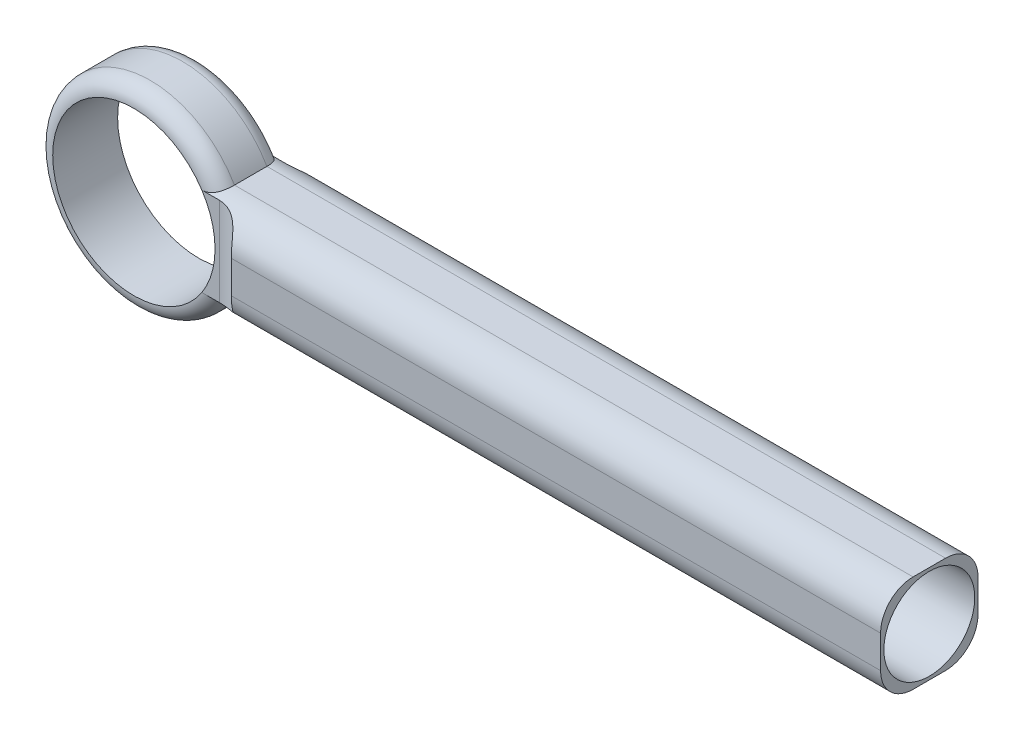
ISO-10303-21;
HEADER;
FILE_DESCRIPTION(('STEP AP214'),'2;1');
FILE_NAME('part.step','',(''),(''),'','','');
FILE_SCHEMA(('AUTOMOTIVE_DESIGN { 1 0 10303 214 1 1 1 1 }'));
ENDSEC;
DATA;
#1=APPLICATION_CONTEXT('core data for automotive mechanical design processes');
#2=APPLICATION_PROTOCOL_DEFINITION('international standard','automotive_design',2000,#1);
#3=PRODUCT_CONTEXT('',#1,'mechanical');
#4=PRODUCT('Part','Part','',(#3));
#5=PRODUCT_RELATED_PRODUCT_CATEGORY('part','',(#4));
#6=PRODUCT_DEFINITION_FORMATION('','',#4);
#7=PRODUCT_DEFINITION_CONTEXT('part definition',#1,'design');
#8=PRODUCT_DEFINITION('design','',#6,#7);
#9=PRODUCT_DEFINITION_SHAPE('','',#8);
#10=(LENGTH_UNIT() NAMED_UNIT(*) SI_UNIT(.MILLI.,.METRE.));
#11=(NAMED_UNIT(*) PLANE_ANGLE_UNIT() SI_UNIT($,.RADIAN.));
#12=(NAMED_UNIT(*) SI_UNIT($,.STERADIAN.) SOLID_ANGLE_UNIT());
#13=UNCERTAINTY_MEASURE_WITH_UNIT(LENGTH_MEASURE(1.E-05),#10,'distance_accuracy_value','');
#14=(GEOMETRIC_REPRESENTATION_CONTEXT(3) GLOBAL_UNCERTAINTY_ASSIGNED_CONTEXT((#13)) GLOBAL_UNIT_ASSIGNED_CONTEXT((#10,
#11,#12)) REPRESENTATION_CONTEXT('',''));
#15=CARTESIAN_POINT('',(0.,0.,0.));
#16=DIRECTION('',(0.,0.,1.));
#17=DIRECTION('',(1.,0.,0.));
#18=AXIS2_PLACEMENT_3D('',#15,#16,#17);
#19=CARTESIAN_POINT('',(0.,0.,2.));
#20=DIRECTION('',(0.,0.,1.));
#21=DIRECTION('',(1.,0.,0.));
#22=AXIS2_PLACEMENT_3D('',#19,#20,#21);
#23=PLANE('',#22);
#24=CARTESIAN_POINT('',(0.,0.,2.));
#25=DIRECTION('',(0.,0.,1.));
#26=DIRECTION('',(1.,0.,0.));
#27=AXIS2_PLACEMENT_3D('',#24,#25,#26);
#28=CIRCLE('',#27,2.5);
#29=CARTESIAN_POINT('',(2.09379430609016,-1.36602540378444,2.));
#30=VERTEX_POINT('',#29);
#31=CARTESIAN_POINT('',(2.09379430609016,1.36602540378444,2.));
#32=VERTEX_POINT('',#31);
#33=EDGE_CURVE('E180',#30,#32,#28,.T.);
#34=ORIENTED_EDGE('',*,*,#33,.F.);
#35=DIRECTION('',(1.,0.,0.));
#36=VECTOR('',#35,1.);
#37=CARTESIAN_POINT('',(3.5,-1.36602540378444,2.));
#38=LINE('',#37,#36);
#39=CARTESIAN_POINT('',(2.63397459621556,-1.36602540378444,2.));
#40=VERTEX_POINT('',#39);
#41=EDGE_CURVE('E288',#30,#40,#38,.T.);
#42=ORIENTED_EDGE('',*,*,#41,.T.);
#43=DIRECTION('',(0.,1.,0.));
#44=VECTOR('',#43,1.);
#45=CARTESIAN_POINT('',(2.63397459621556,1.5,2.));
#46=LINE('',#45,#44);
#47=CARTESIAN_POINT('',(2.63397459621556,1.36602540378444,2.));
#48=VERTEX_POINT('',#47);
#49=EDGE_CURVE('E192',#40,#48,#46,.T.);
#50=ORIENTED_EDGE('',*,*,#49,.T.);
#51=DIRECTION('',(1.,0.,0.));
#52=VECTOR('',#51,1.);
#53=CARTESIAN_POINT('',(23.5,1.36602540378444,2.));
#54=LINE('',#53,#52);
#55=EDGE_CURVE('E217',#48,#32,#54,.F.);
#56=ORIENTED_EDGE('',*,*,#55,.T.);
#57=EDGE_LOOP('',(#34,#42,#50,#56));
#58=FACE_BOUND('',#57,.T.);
#59=ADVANCED_FACE('F46',(#58),#23,.T.);
#60=CARTESIAN_POINT('',(0.,0.,0.));
#61=DIRECTION('',(0.,0.,1.));
#62=DIRECTION('',(1.,0.,0.));
#63=AXIS2_PLACEMENT_3D('',#60,#61,#62);
#64=PLANE('',#63);
#65=DIRECTION('',(0.,-1.,0.));
#66=VECTOR('',#65,1.);
#67=CARTESIAN_POINT('',(2.63397459621556,0.,0.));
#68=LINE('',#67,#66);
#69=CARTESIAN_POINT('',(2.63397459621556,1.36602540378444,0.));
#70=VERTEX_POINT('',#69);
#71=CARTESIAN_POINT('',(2.63397459621556,-1.36602540378444,0.));
#72=VERTEX_POINT('',#71);
#73=EDGE_CURVE('E190',#70,#72,#68,.T.);
#74=ORIENTED_EDGE('',*,*,#73,.T.);
#75=DIRECTION('',(-1.,0.,0.));
#76=VECTOR('',#75,1.);
#77=CARTESIAN_POINT('',(23.5,-1.36602540378444,0.));
#78=LINE('',#77,#76);
#79=CARTESIAN_POINT('',(2.09379430609016,-1.36602540378444,0.));
#80=VERTEX_POINT('',#79);
#81=EDGE_CURVE('E158',#72,#80,#78,.T.);
#82=ORIENTED_EDGE('',*,*,#81,.T.);
#83=CARTESIAN_POINT('',(0.,0.,0.));
#84=DIRECTION('',(0.,0.,1.));
#85=DIRECTION('',(1.,0.,0.));
#86=AXIS2_PLACEMENT_3D('',#83,#84,#85);
#87=CIRCLE('',#86,2.5);
#88=CARTESIAN_POINT('',(2.09379430609016,1.36602540378444,0.));
#89=VERTEX_POINT('',#88);
#90=EDGE_CURVE('E184',#80,#89,#87,.T.);
#91=ORIENTED_EDGE('',*,*,#90,.T.);
#92=DIRECTION('',(-1.,0.,0.));
#93=VECTOR('',#92,1.);
#94=CARTESIAN_POINT('',(2.59807621135332,1.36602540378444,0.));
#95=LINE('',#94,#93);
#96=EDGE_CURVE('E296',#89,#70,#95,.F.);
#97=ORIENTED_EDGE('',*,*,#96,.T.);
#98=EDGE_LOOP('',(#74,#82,#91,#97));
#99=FACE_BOUND('',#98,.T.);
#100=ADVANCED_FACE('F347',(#99),#64,.F.);
#101=CARTESIAN_POINT('',(0.,0.,2.));
#102=DIRECTION('',(0.,0.,-1.));
#103=DIRECTION('',(-1.,0.,0.));
#104=AXIS2_PLACEMENT_3D('',#101,#102,#103);
#105=CYLINDRICAL_SURFACE('',#104,3.);
#106=DIRECTION('',(0.,0.,-1.));
#107=VECTOR('',#106,1.);
#108=CARTESIAN_POINT('',(2.59807621135332,-1.5,2.));
#109=LINE('',#108,#107);
#110=CARTESIAN_POINT('',(2.59807621135332,-1.5,1.5));
#111=VERTEX_POINT('',#110);
#112=CARTESIAN_POINT('',(2.59807621135332,-1.5,0.5));
#113=VERTEX_POINT('',#112);
#114=EDGE_CURVE('E187',#111,#113,#109,.T.);
#115=ORIENTED_EDGE('',*,*,#114,.F.);
#116=CARTESIAN_POINT('',(0.,0.,1.5));
#117=DIRECTION('',(0.,0.,1.));
#118=DIRECTION('',(1.,0.,0.));
#119=AXIS2_PLACEMENT_3D('',#116,#117,#118);
#120=CIRCLE('',#119,3.);
#121=CARTESIAN_POINT('',(2.59807621135332,1.5,1.5));
#122=VERTEX_POINT('',#121);
#123=EDGE_CURVE('E294',#111,#122,#120,.F.);
#124=ORIENTED_EDGE('',*,*,#123,.T.);
#125=DIRECTION('',(0.,0.,-1.));
#126=VECTOR('',#125,1.);
#127=CARTESIAN_POINT('',(2.59807621135332,1.5,2.));
#128=LINE('',#127,#126);
#129=CARTESIAN_POINT('',(2.59807621135332,1.5,0.5));
#130=VERTEX_POINT('',#129);
#131=EDGE_CURVE('E179',#122,#130,#128,.T.);
#132=ORIENTED_EDGE('',*,*,#131,.T.);
#133=CARTESIAN_POINT('',(0.,0.,0.5));
#134=DIRECTION('',(0.,0.,1.));
#135=DIRECTION('',(1.,0.,0.));
#136=AXIS2_PLACEMENT_3D('',#133,#134,#135);
#137=CIRCLE('',#136,3.);
#138=EDGE_CURVE('E291',#130,#113,#137,.T.);
#139=ORIENTED_EDGE('',*,*,#138,.T.);
#140=EDGE_LOOP('',(#115,#124,#132,#139));
#141=FACE_BOUND('',#140,.T.);
#142=ADVANCED_FACE('F316',(#141),#105,.T.);
#143=CARTESIAN_POINT('',(3.5,-1.5,2.));
#144=DIRECTION('',(0.,1.,0.));
#145=DIRECTION('',(0.,0.,1.));
#146=AXIS2_PLACEMENT_3D('',#143,#144,#145);
#147=PLANE('',#146);
#148=DIRECTION('',(0.,0.,-1.));
#149=VECTOR('',#148,1.);
#150=CARTESIAN_POINT('',(23.5,-1.5,2.5));
#151=LINE('',#150,#149);
#152=CARTESIAN_POINT('',(23.5,-1.5,1.5));
#153=VERTEX_POINT('',#152);
#154=CARTESIAN_POINT('',(23.5,-1.5,0.5));
#155=VERTEX_POINT('',#154);
#156=EDGE_CURVE('E314',#153,#155,#151,.T.);
#157=ORIENTED_EDGE('',*,*,#156,.F.);
#158=DIRECTION('',(-1.,0.,0.));
#159=VECTOR('',#158,1.);
#160=CARTESIAN_POINT('',(3.5,-1.5,1.5));
#161=LINE('',#160,#159);
#162=EDGE_CURVE('E197',#153,#111,#161,.T.);
#163=ORIENTED_EDGE('',*,*,#162,.T.);
#164=ORIENTED_EDGE('',*,*,#114,.T.);
#165=DIRECTION('',(-1.,0.,0.));
#166=VECTOR('',#165,1.);
#167=CARTESIAN_POINT('',(3.5,-1.5,0.5));
#168=LINE('',#167,#166);
#169=EDGE_CURVE('E195',#113,#155,#168,.F.);
#170=ORIENTED_EDGE('',*,*,#169,.T.);
#171=EDGE_LOOP('',(#157,#163,#164,#170));
#172=FACE_BOUND('',#171,.T.);
#173=ADVANCED_FACE('F312',(#172),#147,.F.);
#174=CARTESIAN_POINT('',(2.59807621135332,1.5,2.));
#175=DIRECTION('',(0.,-1.,0.));
#176=DIRECTION('',(0.,0.,-1.));
#177=AXIS2_PLACEMENT_3D('',#174,#175,#176);
#178=PLANE('',#177);
#179=DIRECTION('',(0.,0.,-1.));
#180=VECTOR('',#179,1.);
#181=CARTESIAN_POINT('',(23.5,1.5,2.5));
#182=LINE('',#181,#180);
#183=CARTESIAN_POINT('',(23.5,1.5,1.5));
#184=VERTEX_POINT('',#183);
#185=CARTESIAN_POINT('',(23.5,1.5,0.5));
#186=VERTEX_POINT('',#185);
#187=EDGE_CURVE('E168',#184,#186,#182,.T.);
#188=ORIENTED_EDGE('',*,*,#187,.T.);
#189=DIRECTION('',(-1.,0.,0.));
#190=VECTOR('',#189,1.);
#191=CARTESIAN_POINT('',(2.59807621135332,1.5,0.5));
#192=LINE('',#191,#190);
#193=EDGE_CURVE('E214',#186,#130,#192,.T.);
#194=ORIENTED_EDGE('',*,*,#193,.T.);
#195=ORIENTED_EDGE('',*,*,#131,.F.);
#196=DIRECTION('',(-1.,0.,0.));
#197=VECTOR('',#196,1.);
#198=CARTESIAN_POINT('',(23.5,1.5,1.5));
#199=LINE('',#198,#197);
#200=EDGE_CURVE('E152',#122,#184,#199,.F.);
#201=ORIENTED_EDGE('',*,*,#200,.T.);
#202=EDGE_LOOP('',(#188,#194,#195,#201));
#203=FACE_BOUND('',#202,.T.);
#204=ADVANCED_FACE('F329',(#203),#178,.F.);
#205=CARTESIAN_POINT('',(0.,0.,2.));
#206=DIRECTION('',(0.,0.,-1.));
#207=DIRECTION('',(-1.,0.,0.));
#208=AXIS2_PLACEMENT_3D('',#205,#206,#207);
#209=CYLINDRICAL_SURFACE('',#208,2.5);
#210=EDGE_CURVE('E176',#32,#30,#28,.T.);
#211=ORIENTED_EDGE('',*,*,#210,.T.);
#212=ORIENTED_EDGE('',*,*,#33,.T.);
#213=EDGE_LOOP('',(#211,#212));
#214=FACE_BOUND('',#213,.T.);
#215=EDGE_CURVE('E181',#89,#80,#87,.T.);
#216=ORIENTED_EDGE('',*,*,#215,.F.);
#217=ORIENTED_EDGE('',*,*,#90,.F.);
#218=EDGE_LOOP('',(#216,#217));
#219=FACE_BOUND('',#218,.T.);
#220=ADVANCED_FACE('F325',(#214,#219),#209,.F.);
#221=CARTESIAN_POINT('',(23.5,-1.5,2.5));
#222=DIRECTION('',(0.,0.,1.));
#223=DIRECTION('',(1.,0.,0.));
#224=AXIS2_PLACEMENT_3D('',#221,#222,#223);
#225=PLANE('',#224);
#226=DIRECTION('',(0.,1.,0.));
#227=VECTOR('',#226,1.);
#228=CARTESIAN_POINT('',(3.5,-1.5,2.5));
#229=LINE('',#228,#227);
#230=CARTESIAN_POINT('',(3.5,-0.5,2.5));
#231=VERTEX_POINT('',#230);
#232=CARTESIAN_POINT('',(3.5,0.5,2.5));
#233=VERTEX_POINT('',#232);
#234=EDGE_CURVE('E165',#231,#233,#229,.T.);
#235=ORIENTED_EDGE('',*,*,#234,.F.);
#236=DIRECTION('',(-1.,0.,0.));
#237=VECTOR('',#236,1.);
#238=CARTESIAN_POINT('',(23.5,-0.5,2.5));
#239=LINE('',#238,#237);
#240=CARTESIAN_POINT('',(23.5,-0.5,2.5));
#241=VERTEX_POINT('',#240);
#242=EDGE_CURVE('E202',#231,#241,#239,.F.);
#243=ORIENTED_EDGE('',*,*,#242,.T.);
#244=DIRECTION('',(0.,1.,0.));
#245=VECTOR('',#244,1.);
#246=CARTESIAN_POINT('',(23.5,-1.5,2.5));
#247=LINE('',#246,#245);
#248=CARTESIAN_POINT('',(23.5,0.5,2.5));
#249=VERTEX_POINT('',#248);
#250=EDGE_CURVE('E173',#241,#249,#247,.T.);
#251=ORIENTED_EDGE('',*,*,#250,.T.);
#252=DIRECTION('',(-1.,0.,0.));
#253=VECTOR('',#252,1.);
#254=CARTESIAN_POINT('',(3.5,0.5,2.5));
#255=LINE('',#254,#253);
#256=EDGE_CURVE('E200',#249,#233,#255,.T.);
#257=ORIENTED_EDGE('',*,*,#256,.T.);
#258=EDGE_LOOP('',(#235,#243,#251,#257));
#259=FACE_BOUND('',#258,.T.);
#260=ADVANCED_FACE('F328',(#259),#225,.T.);
#261=CARTESIAN_POINT('',(23.5,-1.5,-0.5));
#262=DIRECTION('',(0.,0.,1.));
#263=DIRECTION('',(1.,0.,0.));
#264=AXIS2_PLACEMENT_3D('',#261,#262,#263);
#265=PLANE('',#264);
#266=DIRECTION('',(0.,1.,0.));
#267=VECTOR('',#266,1.);
#268=CARTESIAN_POINT('',(23.5,-1.5,-0.5));
#269=LINE('',#268,#267);
#270=CARTESIAN_POINT('',(23.5,-0.5,-0.5));
#271=VERTEX_POINT('',#270);
#272=CARTESIAN_POINT('',(23.5,0.5,-0.5));
#273=VERTEX_POINT('',#272);
#274=EDGE_CURVE('E149',#271,#273,#269,.T.);
#275=ORIENTED_EDGE('',*,*,#274,.F.);
#276=DIRECTION('',(-1.,0.,0.));
#277=VECTOR('',#276,1.);
#278=CARTESIAN_POINT('',(23.5,-0.5,-0.5));
#279=LINE('',#278,#277);
#280=CARTESIAN_POINT('',(3.5,-0.5,-0.5));
#281=VERTEX_POINT('',#280);
#282=EDGE_CURVE('E145',#271,#281,#279,.T.);
#283=ORIENTED_EDGE('',*,*,#282,.T.);
#284=DIRECTION('',(0.,1.,0.));
#285=VECTOR('',#284,1.);
#286=CARTESIAN_POINT('',(3.5,-1.5,-0.5));
#287=LINE('',#286,#285);
#288=CARTESIAN_POINT('',(3.5,0.5,-0.5));
#289=VERTEX_POINT('',#288);
#290=EDGE_CURVE('E147',#281,#289,#287,.T.);
#291=ORIENTED_EDGE('',*,*,#290,.T.);
#292=DIRECTION('',(-1.,0.,0.));
#293=VECTOR('',#292,1.);
#294=CARTESIAN_POINT('',(23.5,0.5,-0.5));
#295=LINE('',#294,#293);
#296=EDGE_CURVE('E153',#289,#273,#295,.F.);
#297=ORIENTED_EDGE('',*,*,#296,.T.);
#298=EDGE_LOOP('',(#275,#283,#291,#297));
#299=FACE_BOUND('',#298,.T.);
#300=ADVANCED_FACE('F146',(#299),#265,.F.);
#301=CARTESIAN_POINT('',(23.5,0.,0.));
#302=DIRECTION('',(1.,0.,0.));
#303=DIRECTION('',(0.,0.,-1.));
#304=AXIS2_PLACEMENT_3D('',#301,#302,#303);
#305=PLANE('',#304);
#306=CARTESIAN_POINT('',(23.5,0.,1.));
#307=DIRECTION('',(1.,0.,0.));
#308=DIRECTION('',(0.,0.,-1.));
#309=AXIS2_PLACEMENT_3D('',#306,#307,#308);
#310=CIRCLE('',#309,1.4);
#311=CARTESIAN_POINT('',(23.5,0.,-0.4));
#312=VERTEX_POINT('',#311);
#313=EDGE_CURVE('E160',#312,#312,#310,.T.);
#314=ORIENTED_EDGE('',*,*,#313,.F.);
#315=EDGE_LOOP('',(#314));
#316=FACE_BOUND('',#315,.T.);
#317=ORIENTED_EDGE('',*,*,#250,.F.);
#318=CARTESIAN_POINT('',(23.5,-0.5,1.5));
#319=DIRECTION('',(1.,0.,0.));
#320=DIRECTION('',(0.,0.,-1.));
#321=AXIS2_PLACEMENT_3D('',#318,#319,#320);
#322=CIRCLE('',#321,1.);
#323=EDGE_CURVE('E210',#241,#153,#322,.T.);
#324=ORIENTED_EDGE('',*,*,#323,.T.);
#325=ORIENTED_EDGE('',*,*,#156,.T.);
#326=CARTESIAN_POINT('',(23.5,-0.5,0.5));
#327=DIRECTION('',(1.,0.,0.));
#328=DIRECTION('',(0.,0.,-1.));
#329=AXIS2_PLACEMENT_3D('',#326,#327,#328);
#330=CIRCLE('',#329,1.);
#331=EDGE_CURVE('E208',#155,#271,#330,.T.);
#332=ORIENTED_EDGE('',*,*,#331,.T.);
#333=ORIENTED_EDGE('',*,*,#274,.T.);
#334=CARTESIAN_POINT('',(23.5,0.5,0.5));
#335=DIRECTION('',(1.,0.,0.));
#336=DIRECTION('',(0.,0.,-1.));
#337=AXIS2_PLACEMENT_3D('',#334,#335,#336);
#338=CIRCLE('',#337,1.);
#339=EDGE_CURVE('E206',#273,#186,#338,.T.);
#340=ORIENTED_EDGE('',*,*,#339,.T.);
#341=ORIENTED_EDGE('',*,*,#187,.F.);
#342=CARTESIAN_POINT('',(23.5,0.5,1.5));
#343=DIRECTION('',(1.,0.,0.));
#344=DIRECTION('',(0.,0.,-1.));
#345=AXIS2_PLACEMENT_3D('',#342,#343,#344);
#346=CIRCLE('',#345,1.);
#347=EDGE_CURVE('E204',#184,#249,#346,.T.);
#348=ORIENTED_EDGE('',*,*,#347,.T.);
#349=EDGE_LOOP('',(#317,#324,#325,#332,#333,#340,#341,#348));
#350=FACE_BOUND('',#349,.T.);
#351=ADVANCED_FACE('F445',(#316,#350),#305,.T.);
#352=CARTESIAN_POINT('',(5.5,0.,1.));
#353=DIRECTION('',(1.,0.,0.));
#354=DIRECTION('',(0.,0.,-1.));
#355=AXIS2_PLACEMENT_3D('',#352,#353,#354);
#356=CYLINDRICAL_SURFACE('',#355,1.4);
#357=CARTESIAN_POINT('',(5.5,0.,1.));
#358=DIRECTION('',(1.,0.,0.));
#359=DIRECTION('',(0.,0.,-1.));
#360=AXIS2_PLACEMENT_3D('',#357,#358,#359);
#361=CIRCLE('',#360,1.4);
#362=CARTESIAN_POINT('',(5.5,0.,-0.4));
#363=VERTEX_POINT('',#362);
#364=EDGE_CURVE('E166',#363,#363,#361,.T.);
#365=ORIENTED_EDGE('',*,*,#364,.F.);
#366=EDGE_LOOP('',(#365));
#367=FACE_BOUND('',#366,.T.);
#368=ORIENTED_EDGE('',*,*,#313,.T.);
#369=EDGE_LOOP('',(#368));
#370=FACE_BOUND('',#369,.T.);
#371=ADVANCED_FACE('F435',(#367,#370),#356,.F.);
#372=CARTESIAN_POINT('',(5.5,0.,1.));
#373=DIRECTION('',(1.,0.,0.));
#374=DIRECTION('',(0.,0.,-1.));
#375=AXIS2_PLACEMENT_3D('',#372,#373,#374);
#376=PLANE('',#375);
#377=ORIENTED_EDGE('',*,*,#364,.T.);
#378=EDGE_LOOP('',(#377));
#379=FACE_BOUND('',#378,.T.);
#380=ADVANCED_FACE('F241',(#379),#376,.T.);
#381=CARTESIAN_POINT('',(23.5,-0.5,0.5));
#382=DIRECTION('',(-1.,0.,0.));
#383=DIRECTION('',(0.,0.,1.));
#384=AXIS2_PLACEMENT_3D('',#381,#382,#383);
#385=CYLINDRICAL_SURFACE('',#384,1.);
#386=ORIENTED_EDGE('',*,*,#169,.F.);
#387=CARTESIAN_POINT('',(2.59807621135332,-1.5,0.5));
#388=CARTESIAN_POINT('',(2.59808149533558,-1.50003846544081,0.471928428983693));
#389=CARTESIAN_POINT('',(2.59602963577986,-1.49881950310798,0.443863417175439));
#390=CARTESIAN_POINT('',(2.58785145960136,-1.49414584229404,0.388538391734992));
#391=CARTESIAN_POINT('',(2.58172725794721,-1.49069230436361,0.361277967911621));
#392=CARTESIAN_POINT('',(2.56543962881173,-1.48182561114479,0.308308534329286));
#393=CARTESIAN_POINT('',(2.55527395830031,-1.47641136780662,0.282600395236081));
#394=CARTESIAN_POINT('',(2.5309844886875,-1.4641634346591,0.233489038742717));
#395=CARTESIAN_POINT('',(2.51686043693023,-1.45732965425064,0.210085968599584));
#396=CARTESIAN_POINT('',(2.4849496697262,-1.44302230806337,0.166486052502553));
#397=CARTESIAN_POINT('',(2.46719708612167,-1.43555505852822,0.146262229243917));
#398=CARTESIAN_POINT('',(2.42826048823375,-1.42078010318469,0.109412730151285));
#399=CARTESIAN_POINT('',(2.40708093346393,-1.41347220385295,0.0927824428679559));
#400=CARTESIAN_POINT('',(2.36289411571942,-1.40021067238548,0.0642734050706432));
#401=CARTESIAN_POINT('',(2.34002386189402,-1.39420879160047,0.0522045040673877));
#402=CARTESIAN_POINT('',(2.29226730090928,-1.38374635519998,0.0318940292243437));
#403=CARTESIAN_POINT('',(2.26737739817591,-1.37928862638536,0.0236594653280156));
#404=CARTESIAN_POINT('',(2.21686796368085,-1.37234216506932,0.0110481170752836));
#405=CARTESIAN_POINT('',(2.19126818656513,-1.36982106629227,0.00660777270885052));
#406=CARTESIAN_POINT('',(2.13967701499237,-1.3665910143585,0.000984458687847859));
#407=CARTESIAN_POINT('',(2.11368719783298,-1.36587608879564,-0.000209247510235789));
#408=CARTESIAN_POINT('',(2.08778142835607,-1.36603998643522,2.52587427201766E-05));
#409=B_SPLINE_CURVE_WITH_KNOTS('',3,(#387,#388,#389,#390,#391,#392,#393,#394,#395,#396,#397,
#398,#399,#400,#401,#402,#403,#404,#405,#406,#407,#408),.UNSPECIFIED.,.F.,.F.,(4,2,2,2,2,2,2,2,
2,2,4),(0.,0.0841042626174883,0.168164879811567,0.252272216233469,0.336384922288198,
0.419740102463262,0.50298767233088,0.582228984934895,0.661614603332381,0.739642731013352,
0.817412506255848),.UNSPECIFIED.);
#410=EDGE_CURVE('E60',#113,#80,#409,.T.);
#411=ORIENTED_EDGE('',*,*,#410,.T.);
#412=ORIENTED_EDGE('',*,*,#81,.F.);
#413=CARTESIAN_POINT('',(2.29013763087457,-1.32783569773584,-0.0609706387630388));
#414=CARTESIAN_POINT('',(2.31210551721253,-1.33328315448431,-0.0529248066772142));
#415=CARTESIAN_POINT('',(2.33448351654507,-1.3380757174635,-0.0456081612417677));
#416=CARTESIAN_POINT('',(2.37990829962844,-1.34645093922943,-0.0325244574585626));
#417=CARTESIAN_POINT('',(2.40295505132755,-1.35003365589761,-0.0267573249817387));
#418=CARTESIAN_POINT('',(2.47249596377242,-1.35906834654009,-0.0119963010578321));
#419=CARTESIAN_POINT('',(2.51975252887282,-1.36289193862705,-0.00540937067619011));
#420=CARTESIAN_POINT('',(2.60182871818909,-1.36607661554435,8.70890568588394E-05));
#421=CARTESIAN_POINT('',(2.63652747680416,-1.36636995737951,0.000599846150230011));
#422=CARTESIAN_POINT('',(2.71750209541895,-1.36462987423739,-0.00241973504656658));
#423=CARTESIAN_POINT('',(2.76372112563547,-1.36177526576741,-0.0073800234316592));
#424=CARTESIAN_POINT('',(2.85468515625747,-1.35203731984839,-0.0235644057638239));
#425=CARTESIAN_POINT('',(2.89942763685296,-1.34514743715436,-0.0347986747757215));
#426=CARTESIAN_POINT('',(2.98619612738353,-1.3266481646182,-0.06297154942327));
#427=CARTESIAN_POINT('',(3.02821553425272,-1.31502776640036,-0.0799234446526977));
#428=CARTESIAN_POINT('',(3.10802663833618,-1.28623428283682,-0.11839198039671));
#429=CARTESIAN_POINT('',(3.14582271386292,-1.26906702114806,-0.139903825304268));
#430=CARTESIAN_POINT('',(3.2143989827501,-1.22940571693938,-0.184702433520055));
#431=CARTESIAN_POINT('',(3.24541890890526,-1.20718720088969,-0.207865192575666));
#432=CARTESIAN_POINT('',(3.30176994458686,-1.15690625023043,-0.254752002693015));
#433=CARTESIAN_POINT('',(3.32710290492945,-1.12884572264342,-0.278475868356797));
#434=CARTESIAN_POINT('',(3.37043574772545,-1.06938158872739,-0.322854105564232));
#435=CARTESIAN_POINT('',(3.38881031875073,-1.0383227275263,-0.343607704441334));
#436=CARTESIAN_POINT('',(3.42078999122684,-0.972243200274691,-0.382299739796028));
#437=CARTESIAN_POINT('',(3.43439310533671,-0.937220891437464,-0.400237001537952));
#438=CARTESIAN_POINT('',(3.45776881539359,-0.862893495354611,-0.432743888850786));
#439=CARTESIAN_POINT('',(3.46739344819178,-0.823482486841039,-0.447176348869598));
#440=CARTESIAN_POINT('',(3.48276471477388,-0.742467217596767,-0.471078309165203));
#441=CARTESIAN_POINT('',(3.48851181823694,-0.700863223157496,-0.480548410493809));
#442=CARTESIAN_POINT('',(3.49507195623705,-0.632511007771616,-0.491537166760339));
#443=CARTESIAN_POINT('',(3.49692958261273,-0.606111363999278,-0.494709258015812));
#444=CARTESIAN_POINT('',(3.49938833300597,-0.553143637899419,-0.498940119904033));
#445=CARTESIAN_POINT('',(3.49999221796632,-0.526576055194748,-0.500003533954952));
#446=CARTESIAN_POINT('',(3.5,-0.5,-0.5));
#447=B_SPLINE_CURVE_WITH_KNOTS('',3,(#413,#414,#415,#416,#417,#418,#419,#420,#421,#422,#423,
#424,#425,#426,#427,#428,#429,#430,#431,#432,#433,#434,#435,#436,#437,#438,#439,#440,#441,#442,
#443,#444,#445,#446),.UNSPECIFIED.,.F.,.F.,(4,2,2,2,2,2,2,2,2,2,2,2,2,2,2,2,4),(0.,
0.0720059118451153,0.144008378296815,0.286843817760882,0.390747628512605,0.529821281128661,
0.66912113943439,0.808747032375095,0.948226805725876,1.08140853051865,1.2145468484397,
1.33886274009248,1.46323034876147,1.59187870641495,1.72051147829217,1.80037026038953,
1.88005299309224),.UNSPECIFIED.);
#448=EDGE_CURVE('E67',#281,#72,#447,.F.);
#449=ORIENTED_EDGE('',*,*,#448,.F.);
#450=ORIENTED_EDGE('',*,*,#282,.F.);
#451=ORIENTED_EDGE('',*,*,#331,.F.);
#452=EDGE_LOOP('',(#386,#411,#412,#449,#450,#451));
#453=FACE_BOUND('',#452,.T.);
#454=ADVANCED_FACE('F156',(#453),#385,.T.);
#455=CARTESIAN_POINT('',(2.59807621135332,0.5,0.5));
#456=DIRECTION('',(-1.,0.,0.));
#457=DIRECTION('',(0.,0.,1.));
#458=AXIS2_PLACEMENT_3D('',#455,#456,#457);
#459=CYLINDRICAL_SURFACE('',#458,1.);
#460=ORIENTED_EDGE('',*,*,#339,.F.);
#461=ORIENTED_EDGE('',*,*,#296,.F.);
#462=CARTESIAN_POINT('',(3.5,0.5,-0.5));
#463=CARTESIAN_POINT('',(3.49999549474033,0.523384037448647,-0.50000077305293));
#464=CARTESIAN_POINT('',(3.49952665131411,0.546757723793365,-0.499179059222522));
#465=CARTESIAN_POINT('',(3.49762696942142,0.593355271281109,-0.495906991239166));
#466=CARTESIAN_POINT('',(3.4961959695002,0.616579106617931,-0.493456363747001));
#467=CARTESIAN_POINT('',(3.49040342985895,0.6858985228991,-0.483674996915071));
#468=CARTESIAN_POINT('',(3.48454213435901,0.731561826014294,-0.473914873056089));
#469=CARTESIAN_POINT('',(3.46822462555441,0.820414566404935,-0.448407179736225));
#470=CARTESIAN_POINT('',(3.45775972035183,0.863599148498354,-0.432648291857763));
#471=CARTESIAN_POINT('',(3.43140249570919,0.945984946084837,-0.39616925335076));
#472=CARTESIAN_POINT('',(3.41551927234155,0.985192695544976,-0.375457434831119));
#473=CARTESIAN_POINT('',(3.37832902940098,1.05685805643595,-0.331625814352214));
#474=CARTESIAN_POINT('',(3.35727262200604,1.08952732053427,-0.308640495091998));
#475=CARTESIAN_POINT('',(3.30915904805092,1.14917470159004,-0.261587927672899));
#476=CARTESIAN_POINT('',(3.28210364348777,1.17615448510433,-0.237520998850762));
#477=CARTESIAN_POINT('',(3.22454091303707,1.2223378333234,-0.192242824620923));
#478=CARTESIAN_POINT('',(3.19443635061925,1.24196867319432,-0.170951970408253));
#479=CARTESIAN_POINT('',(3.13003609322716,1.27632683024188,-0.130884721981983));
#480=CARTESIAN_POINT('',(3.09573841192839,1.29105181106216,-0.112109528358754));
#481=CARTESIAN_POINT('',(3.02307211727542,1.31638656462853,-0.0779081919351372));
#482=CARTESIAN_POINT('',(2.98462953832904,1.32689679483458,-0.0625664652356959));
#483=CARTESIAN_POINT('',(2.90536499813357,1.34396236153638,-0.0366285496556489));
#484=CARTESIAN_POINT('',(2.86454434594404,1.35051985175701,-0.026029777299481));
#485=CARTESIAN_POINT('',(2.79808504474258,1.35826877792121,-0.0132288543544316));
#486=CARTESIAN_POINT('',(2.77287401844992,1.36055720343853,-0.00936374579671561));
#487=CARTESIAN_POINT('',(2.72217408561434,1.36396071716082,-0.00357156259184055));
#488=CARTESIAN_POINT('',(2.69668553734174,1.3650771703178,-0.0016422335313355));
#489=CARTESIAN_POINT('',(2.65876695561979,1.36589206529641,-0.000230077153601056));
#490=CARTESIAN_POINT('',(2.64636945544473,1.36602462017053,9.04028104003397E-07));
#491=CARTESIAN_POINT('',(2.63397459621556,1.36602540378446,0.));
#492=B_SPLINE_CURVE_WITH_KNOTS('',3,(#462,#463,#464,#465,#466,#467,#468,#469,#470,#471,#472,
#473,#474,#475,#476,#477,#478,#479,#480,#481,#482,#483,#484,#485,#486,#487,#488,#489,#490,#491),
.UNSPECIFIED.,.F.,.F.,(4,2,2,2,2,2,2,2,2,2,2,2,2,2,4),(0.,0.0701120546075352,0.140235877311987,
0.280721239002966,0.421472991786802,0.56198960913339,0.696712956645961,0.831396786148936,
0.956129085241606,1.08092070196203,1.20850695759707,1.33602363246917,1.41275991841719,
1.48940673301282,1.52659515059738),.UNSPECIFIED.);
#493=EDGE_CURVE('E161',#70,#289,#492,.F.);
#494=ORIENTED_EDGE('',*,*,#493,.F.);
#495=ORIENTED_EDGE('',*,*,#96,.F.);
#496=CARTESIAN_POINT('',(2.59807621135332,1.5,0.5));
#497=CARTESIAN_POINT('',(2.59808149533558,1.50003846544081,0.471928428983693));
#498=CARTESIAN_POINT('',(2.59602963577986,1.49881950310798,0.443863417175439));
#499=CARTESIAN_POINT('',(2.58785145960136,1.49414584229404,0.388538391734992));
#500=CARTESIAN_POINT('',(2.58172725794721,1.49069230436361,0.361277967911621));
#501=CARTESIAN_POINT('',(2.56543962881173,1.48182561114479,0.308308534329286));
#502=CARTESIAN_POINT('',(2.55527395830031,1.47641136780662,0.282600395236081));
#503=CARTESIAN_POINT('',(2.5309844886875,1.4641634346591,0.233489038742717));
#504=CARTESIAN_POINT('',(2.51686043693023,1.45732965425064,0.210085968599584));
#505=CARTESIAN_POINT('',(2.4849496697262,1.44302230806337,0.166486052502553));
#506=CARTESIAN_POINT('',(2.46719708612167,1.43555505852822,0.146262229243917));
#507=CARTESIAN_POINT('',(2.42826048823375,1.42078010318469,0.109412730151285));
#508=CARTESIAN_POINT('',(2.40708093346393,1.41347220385295,0.0927824428679559));
#509=CARTESIAN_POINT('',(2.36289411571942,1.40021067238548,0.0642734050706432));
#510=CARTESIAN_POINT('',(2.34002386189402,1.39420879160047,0.0522045040673877));
#511=CARTESIAN_POINT('',(2.29226730090928,1.38374635519998,0.0318940292243437));
#512=CARTESIAN_POINT('',(2.26737739817591,1.37928862638536,0.0236594653280156));
#513=CARTESIAN_POINT('',(2.21686796368085,1.37234216506932,0.0110481170752836));
#514=CARTESIAN_POINT('',(2.19126818656513,1.36982106629227,0.00660777270885052));
#515=CARTESIAN_POINT('',(2.13967701499237,1.3665910143585,0.000984458687847859));
#516=CARTESIAN_POINT('',(2.11368719783298,1.36587608879564,-0.000209247510235789));
#517=CARTESIAN_POINT('',(2.08778142835607,1.36603998643522,2.52587427201766E-05));
#518=B_SPLINE_CURVE_WITH_KNOTS('',3,(#496,#497,#498,#499,#500,#501,#502,#503,#504,#505,#506,
#507,#508,#509,#510,#511,#512,#513,#514,#515,#516,#517),.UNSPECIFIED.,.F.,.F.,(4,2,2,2,2,2,2,2,
2,2,4),(0.,0.0841042626174883,0.168164879811567,0.252272216233469,0.336384922288198,
0.419740102463262,0.50298767233088,0.582228984934895,0.661614603332381,0.739642731013352,
0.817412506255848),.UNSPECIFIED.);
#519=EDGE_CURVE('E11',#89,#130,#518,.F.);
#520=ORIENTED_EDGE('',*,*,#519,.T.);
#521=ORIENTED_EDGE('',*,*,#193,.F.);
#522=EDGE_LOOP('',(#460,#461,#494,#495,#520,#521));
#523=FACE_BOUND('',#522,.T.);
#524=ADVANCED_FACE('F232',(#523),#459,.T.);
#525=CARTESIAN_POINT('',(2.63397459621556,0.,-1.));
#526=DIRECTION('',(0.,-1.,0.));
#527=DIRECTION('',(0.,0.,-1.));
#528=AXIS2_PLACEMENT_3D('',#525,#526,#527);
#529=CYLINDRICAL_SURFACE('',#528,1.);
#530=ORIENTED_EDGE('',*,*,#448,.T.);
#531=ORIENTED_EDGE('',*,*,#73,.F.);
#532=ORIENTED_EDGE('',*,*,#493,.T.);
#533=ORIENTED_EDGE('',*,*,#290,.F.);
#534=EDGE_LOOP('',(#530,#531,#532,#533));
#535=FACE_BOUND('',#534,.T.);
#536=ADVANCED_FACE('F163',(#535),#529,.F.);
#537=CARTESIAN_POINT('',(23.5,0.5,1.5));
#538=DIRECTION('',(1.,0.,0.));
#539=DIRECTION('',(0.,0.,-1.));
#540=AXIS2_PLACEMENT_3D('',#537,#538,#539);
#541=CYLINDRICAL_SURFACE('',#540,1.);
#542=ORIENTED_EDGE('',*,*,#200,.F.);
#543=CARTESIAN_POINT('',(2.59807621135332,1.5,1.5));
#544=CARTESIAN_POINT('',(2.59808149533558,1.50003846544081,1.52807157101631));
#545=CARTESIAN_POINT('',(2.59602963577986,1.49881950310798,1.55613658282456));
#546=CARTESIAN_POINT('',(2.58785145960136,1.49414584229404,1.61146160826501));
#547=CARTESIAN_POINT('',(2.58172725794721,1.49069230436361,1.63872203208838));
#548=CARTESIAN_POINT('',(2.56543962881173,1.48182561114479,1.69169146567071));
#549=CARTESIAN_POINT('',(2.55527395830031,1.47641136780662,1.71739960476392));
#550=CARTESIAN_POINT('',(2.5309844886875,1.4641634346591,1.76651096125728));
#551=CARTESIAN_POINT('',(2.51686043693023,1.45732965425064,1.78991403140042));
#552=CARTESIAN_POINT('',(2.4849496697262,1.44302230806337,1.83351394749745));
#553=CARTESIAN_POINT('',(2.46719708612167,1.43555505852822,1.85373777075608));
#554=CARTESIAN_POINT('',(2.42826048823375,1.42078010318469,1.89058726984872));
#555=CARTESIAN_POINT('',(2.40708093346393,1.41347220385295,1.90721755713204));
#556=CARTESIAN_POINT('',(2.36289411571942,1.40021067238548,1.93572659492936));
#557=CARTESIAN_POINT('',(2.34002386189402,1.39420879160047,1.94779549593261));
#558=CARTESIAN_POINT('',(2.29226730090928,1.38374635519998,1.96810597077566));
#559=CARTESIAN_POINT('',(2.26737739817591,1.37928862638536,1.97634053467198));
#560=CARTESIAN_POINT('',(2.21686796368085,1.37234216506932,1.98895188292472));
#561=CARTESIAN_POINT('',(2.19126818656513,1.36982106629227,1.99339222729115));
#562=CARTESIAN_POINT('',(2.13967701499237,1.3665910143585,1.99901554131215));
#563=CARTESIAN_POINT('',(2.11368719783298,1.36587608879564,2.00020924751024));
#564=CARTESIAN_POINT('',(2.08778142835607,1.36603998643522,1.99997474125728));
#565=B_SPLINE_CURVE_WITH_KNOTS('',3,(#543,#544,#545,#546,#547,#548,#549,#550,#551,#552,#553,
#554,#555,#556,#557,#558,#559,#560,#561,#562,#563,#564),.UNSPECIFIED.,.F.,.F.,(4,2,2,2,2,2,2,2,
2,2,4),(0.,0.0841042626174881,0.168164879811567,0.252272216233469,0.336384922288197,
0.419740102463261,0.50298767233088,0.582228984934895,0.661614603332381,0.739642731013351,
0.817412506255848),.UNSPECIFIED.);
#566=EDGE_CURVE('E249',#122,#32,#565,.T.);
#567=ORIENTED_EDGE('',*,*,#566,.T.);
#568=ORIENTED_EDGE('',*,*,#55,.F.);
#569=CARTESIAN_POINT('',(2.29013763087457,1.32783569773584,2.06097063876304));
#570=CARTESIAN_POINT('',(2.31210551721253,1.33328315448431,2.05292480667721));
#571=CARTESIAN_POINT('',(2.33448351654506,1.3380757174635,2.04560816124177));
#572=CARTESIAN_POINT('',(2.37990829962844,1.34645093922943,2.03252445745856));
#573=CARTESIAN_POINT('',(2.40295505132755,1.35003365589761,2.02675732498174));
#574=CARTESIAN_POINT('',(2.47249596377242,1.35906834654009,2.01199630105783));
#575=CARTESIAN_POINT('',(2.51975252887282,1.36289193862705,2.00540937067619));
#576=CARTESIAN_POINT('',(2.60182871818909,1.36607661554435,1.99991291094314));
#577=CARTESIAN_POINT('',(2.63652747680416,1.36636995737951,1.99940015384977));
#578=CARTESIAN_POINT('',(2.71750209541895,1.36462987423739,2.00241973504657));
#579=CARTESIAN_POINT('',(2.76372112563547,1.36177526576741,2.00738002343166));
#580=CARTESIAN_POINT('',(2.85468515625747,1.35203731984839,2.02356440576382));
#581=CARTESIAN_POINT('',(2.89942763685296,1.34514743715436,2.03479867477572));
#582=CARTESIAN_POINT('',(2.98619612738353,1.3266481646182,2.06297154942327));
#583=CARTESIAN_POINT('',(3.02821553425272,1.31502776640036,2.0799234446527));
#584=CARTESIAN_POINT('',(3.10802663833617,1.28623428283682,2.11839198039671));
#585=CARTESIAN_POINT('',(3.14582271386292,1.26906702114806,2.13990382530427));
#586=CARTESIAN_POINT('',(3.2143989827501,1.22940571693938,2.18470243352005));
#587=CARTESIAN_POINT('',(3.24541890890526,1.20718720088969,2.20786519257567));
#588=CARTESIAN_POINT('',(3.30176994458686,1.15690625023043,2.25475200269302));
#589=CARTESIAN_POINT('',(3.32710290492945,1.12884572264342,2.2784758683568));
#590=CARTESIAN_POINT('',(3.37043574772545,1.06938158872739,2.32285410556423));
#591=CARTESIAN_POINT('',(3.38881031875073,1.0383227275263,2.34360770444133));
#592=CARTESIAN_POINT('',(3.42078999122684,0.972243200274691,2.38229973979603));
#593=CARTESIAN_POINT('',(3.43439310533671,0.937220891437464,2.40023700153795));
#594=CARTESIAN_POINT('',(3.45776881539359,0.862893495354611,2.43274388885079));
#595=CARTESIAN_POINT('',(3.46739344819178,0.823482486841039,2.4471763488696));
#596=CARTESIAN_POINT('',(3.48276471477388,0.742467217596767,2.4710783091652));
#597=CARTESIAN_POINT('',(3.48851181823694,0.700863223157495,2.48054841049381));
#598=CARTESIAN_POINT('',(3.49507195623704,0.632511007771615,2.49153716676034));
#599=CARTESIAN_POINT('',(3.49692958261273,0.606111363999277,2.49470925801581));
#600=CARTESIAN_POINT('',(3.49938833300597,0.553143637899419,2.49894011990403));
#601=CARTESIAN_POINT('',(3.49999221796632,0.526576055194747,2.50000353395495));
#602=CARTESIAN_POINT('',(3.5,0.5,2.5));
#603=B_SPLINE_CURVE_WITH_KNOTS('',3,(#569,#570,#571,#572,#573,#574,#575,#576,#577,#578,#579,
#580,#581,#582,#583,#584,#585,#586,#587,#588,#589,#590,#591,#592,#593,#594,#595,#596,#597,#598,
#599,#600,#601,#602),.UNSPECIFIED.,.F.,.F.,(4,2,2,2,2,2,2,2,2,2,2,2,2,2,2,2,4),(0.,
0.0720059118451148,0.144008378296814,0.286843817760882,0.390747628512606,0.529821281128661,
0.669121139434391,0.808747032375095,0.948226805725876,1.08140853051865,1.2145468484397,
1.33886274009248,1.46323034876147,1.59187870641495,1.72051147829217,1.80037026038953,
1.88005299309224),.UNSPECIFIED.);
#604=EDGE_CURVE('E75',#233,#48,#603,.F.);
#605=ORIENTED_EDGE('',*,*,#604,.F.);
#606=ORIENTED_EDGE('',*,*,#256,.F.);
#607=ORIENTED_EDGE('',*,*,#347,.F.);
#608=EDGE_LOOP('',(#542,#567,#568,#605,#606,#607));
#609=FACE_BOUND('',#608,.T.);
#610=ADVANCED_FACE('F266',(#609),#541,.T.);
#611=CARTESIAN_POINT('',(3.5,-0.5,1.5));
#612=DIRECTION('',(1.,0.,0.));
#613=DIRECTION('',(0.,0.,-1.));
#614=AXIS2_PLACEMENT_3D('',#611,#612,#613);
#615=CYLINDRICAL_SURFACE('',#614,1.);
#616=ORIENTED_EDGE('',*,*,#323,.F.);
#617=ORIENTED_EDGE('',*,*,#242,.F.);
#618=CARTESIAN_POINT('',(3.5,-0.5,2.5));
#619=CARTESIAN_POINT('',(3.49999549474033,-0.523384037448647,2.50000077305293));
#620=CARTESIAN_POINT('',(3.49952665131411,-0.546757723793365,2.49917905922252));
#621=CARTESIAN_POINT('',(3.49762696942142,-0.593355271281109,2.49590699123917));
#622=CARTESIAN_POINT('',(3.4961959695002,-0.616579106617931,2.493456363747));
#623=CARTESIAN_POINT('',(3.49040342985895,-0.6858985228991,2.48367499691507));
#624=CARTESIAN_POINT('',(3.48454213435901,-0.731561826014294,2.47391487305609));
#625=CARTESIAN_POINT('',(3.46822462555441,-0.820414566404935,2.44840717973622));
#626=CARTESIAN_POINT('',(3.45775972035183,-0.863599148498354,2.43264829185776));
#627=CARTESIAN_POINT('',(3.43140249570919,-0.945984946084837,2.39616925335076));
#628=CARTESIAN_POINT('',(3.41551927234155,-0.985192695544976,2.37545743483112));
#629=CARTESIAN_POINT('',(3.37832902940098,-1.05685805643595,2.33162581435221));
#630=CARTESIAN_POINT('',(3.35727262200604,-1.08952732053427,2.308640495092));
#631=CARTESIAN_POINT('',(3.30915904805092,-1.14917470159004,2.2615879276729));
#632=CARTESIAN_POINT('',(3.28210364348777,-1.17615448510433,2.23752099885076));
#633=CARTESIAN_POINT('',(3.22454091303706,-1.2223378333234,2.19224282462092));
#634=CARTESIAN_POINT('',(3.19443635061925,-1.24196867319432,2.17095197040825));
#635=CARTESIAN_POINT('',(3.13003609322716,-1.27632683024188,2.13088472198198));
#636=CARTESIAN_POINT('',(3.0957384119284,-1.29105181106216,2.11210952835875));
#637=CARTESIAN_POINT('',(3.02307211727542,-1.31638656462853,2.07790819193514));
#638=CARTESIAN_POINT('',(2.98462953832904,-1.32689679483458,2.0625664652357));
#639=CARTESIAN_POINT('',(2.90536499813357,-1.34396236153638,2.03662854965565));
#640=CARTESIAN_POINT('',(2.86454434594404,-1.35051985175701,2.02602977729948));
#641=CARTESIAN_POINT('',(2.79808504474258,-1.35826877792121,2.01322885435443));
#642=CARTESIAN_POINT('',(2.77287401844992,-1.36055720343853,2.00936374579672));
#643=CARTESIAN_POINT('',(2.72217408561434,-1.36396071716082,2.00357156259184));
#644=CARTESIAN_POINT('',(2.69668553734174,-1.3650771703178,2.00164223353134));
#645=CARTESIAN_POINT('',(2.65876695561979,-1.36589206529641,2.0002300771536));
#646=CARTESIAN_POINT('',(2.64636945544473,-1.36602462017053,1.9999990959719));
#647=CARTESIAN_POINT('',(2.63397459621556,-1.36602540378446,2.));
#648=B_SPLINE_CURVE_WITH_KNOTS('',3,(#618,#619,#620,#621,#622,#623,#624,#625,#626,#627,#628,
#629,#630,#631,#632,#633,#634,#635,#636,#637,#638,#639,#640,#641,#642,#643,#644,#645,#646,#647),
.UNSPECIFIED.,.F.,.F.,(4,2,2,2,2,2,2,2,2,2,2,2,2,2,4),(0.,0.0701120546075352,0.140235877311987,
0.280721239002966,0.421472991786802,0.56198960913339,0.696712956645961,0.831396786148936,
0.956129085241606,1.08092070196203,1.20850695759707,1.33602363246917,1.41275991841719,
1.48940673301282,1.52659515059738),.UNSPECIFIED.);
#649=EDGE_CURVE('E281',#40,#231,#648,.F.);
#650=ORIENTED_EDGE('',*,*,#649,.F.);
#651=ORIENTED_EDGE('',*,*,#41,.F.);
#652=CARTESIAN_POINT('',(2.59807621135332,-1.5,1.5));
#653=CARTESIAN_POINT('',(2.59808149533558,-1.50003846544081,1.52807157101631));
#654=CARTESIAN_POINT('',(2.59602963577986,-1.49881950310798,1.55613658282456));
#655=CARTESIAN_POINT('',(2.58785145960136,-1.49414584229404,1.61146160826501));
#656=CARTESIAN_POINT('',(2.58172725794721,-1.49069230436361,1.63872203208838));
#657=CARTESIAN_POINT('',(2.56543962881173,-1.48182561114479,1.69169146567071));
#658=CARTESIAN_POINT('',(2.55527395830031,-1.47641136780662,1.71739960476392));
#659=CARTESIAN_POINT('',(2.5309844886875,-1.4641634346591,1.76651096125728));
#660=CARTESIAN_POINT('',(2.51686043693023,-1.45732965425064,1.78991403140042));
#661=CARTESIAN_POINT('',(2.4849496697262,-1.44302230806337,1.83351394749745));
#662=CARTESIAN_POINT('',(2.46719708612167,-1.43555505852822,1.85373777075608));
#663=CARTESIAN_POINT('',(2.42826048823375,-1.42078010318469,1.89058726984872));
#664=CARTESIAN_POINT('',(2.40708093346393,-1.41347220385295,1.90721755713204));
#665=CARTESIAN_POINT('',(2.36289411571942,-1.40021067238548,1.93572659492936));
#666=CARTESIAN_POINT('',(2.34002386189402,-1.39420879160047,1.94779549593261));
#667=CARTESIAN_POINT('',(2.29226730090928,-1.38374635519998,1.96810597077566));
#668=CARTESIAN_POINT('',(2.26737739817591,-1.37928862638536,1.97634053467198));
#669=CARTESIAN_POINT('',(2.21686796368085,-1.37234216506932,1.98895188292472));
#670=CARTESIAN_POINT('',(2.19126818656513,-1.36982106629227,1.99339222729115));
#671=CARTESIAN_POINT('',(2.13967701499237,-1.3665910143585,1.99901554131215));
#672=CARTESIAN_POINT('',(2.11368719783298,-1.36587608879564,2.00020924751024));
#673=CARTESIAN_POINT('',(2.08778142835607,-1.36603998643522,1.99997474125728));
#674=B_SPLINE_CURVE_WITH_KNOTS('',3,(#652,#653,#654,#655,#656,#657,#658,#659,#660,#661,#662,
#663,#664,#665,#666,#667,#668,#669,#670,#671,#672,#673),.UNSPECIFIED.,.F.,.F.,(4,2,2,2,2,2,2,2,
2,2,4),(0.,0.0841042626174881,0.168164879811567,0.252272216233469,0.336384922288197,
0.419740102463261,0.50298767233088,0.582228984934895,0.661614603332381,0.739642731013351,
0.817412506255848),.UNSPECIFIED.);
#675=EDGE_CURVE('E256',#30,#111,#674,.F.);
#676=ORIENTED_EDGE('',*,*,#675,.T.);
#677=ORIENTED_EDGE('',*,*,#162,.F.);
#678=EDGE_LOOP('',(#616,#617,#650,#651,#676,#677));
#679=FACE_BOUND('',#678,.T.);
#680=ADVANCED_FACE('F270',(#679),#615,.T.);
#681=CARTESIAN_POINT('',(2.63397459621556,0.,3.));
#682=DIRECTION('',(0.,-1.,0.));
#683=DIRECTION('',(0.,0.,-1.));
#684=AXIS2_PLACEMENT_3D('',#681,#682,#683);
#685=CYLINDRICAL_SURFACE('',#684,1.);
#686=ORIENTED_EDGE('',*,*,#49,.F.);
#687=ORIENTED_EDGE('',*,*,#649,.T.);
#688=ORIENTED_EDGE('',*,*,#234,.T.);
#689=ORIENTED_EDGE('',*,*,#604,.T.);
#690=EDGE_LOOP('',(#686,#687,#688,#689));
#691=FACE_BOUND('',#690,.T.);
#692=ADVANCED_FACE('F273',(#691),#685,.F.);
#693=CARTESIAN_POINT('',(0.,0.,1.5));
#694=DIRECTION('',(0.,0.,1.));
#695=DIRECTION('',(1.,0.,0.));
#696=AXIS2_PLACEMENT_3D('',#693,#694,#695);
#697=TOROIDAL_SURFACE('',#696,2.5,0.5);
#698=ORIENTED_EDGE('',*,*,#566,.F.);
#699=ORIENTED_EDGE('',*,*,#123,.F.);
#700=ORIENTED_EDGE('',*,*,#675,.F.);
#701=ORIENTED_EDGE('',*,*,#210,.F.);
#702=EDGE_LOOP('',(#698,#699,#700,#701));
#703=FACE_BOUND('',#702,.T.);
#704=ADVANCED_FACE('F263',(#703),#697,.T.);
#705=CARTESIAN_POINT('',(0.,0.,0.5));
#706=DIRECTION('',(0.,0.,1.));
#707=DIRECTION('',(1.,0.,0.));
#708=AXIS2_PLACEMENT_3D('',#705,#706,#707);
#709=TOROIDAL_SURFACE('',#708,2.5,0.5);
#710=ORIENTED_EDGE('',*,*,#519,.F.);
#711=ORIENTED_EDGE('',*,*,#215,.T.);
#712=ORIENTED_EDGE('',*,*,#410,.F.);
#713=ORIENTED_EDGE('',*,*,#138,.F.);
#714=EDGE_LOOP('',(#710,#711,#712,#713));
#715=FACE_BOUND('',#714,.T.);
#716=ADVANCED_FACE('F48',(#715),#709,.T.);
#717=CLOSED_SHELL('',(#59,#100,#142,#173,#204,#220,#260,#300,#351,#371,#380,#454,#524,#536,#610,
#680,#692,#704,#716));
#718=MANIFOLD_SOLID_BREP('B2',#717);
#719=ADVANCED_BREP_SHAPE_REPRESENTATION('',(#18,#718),#14);
#720=SHAPE_DEFINITION_REPRESENTATION(#9,#719);
ENDSEC;
END-ISO-10303-21;
